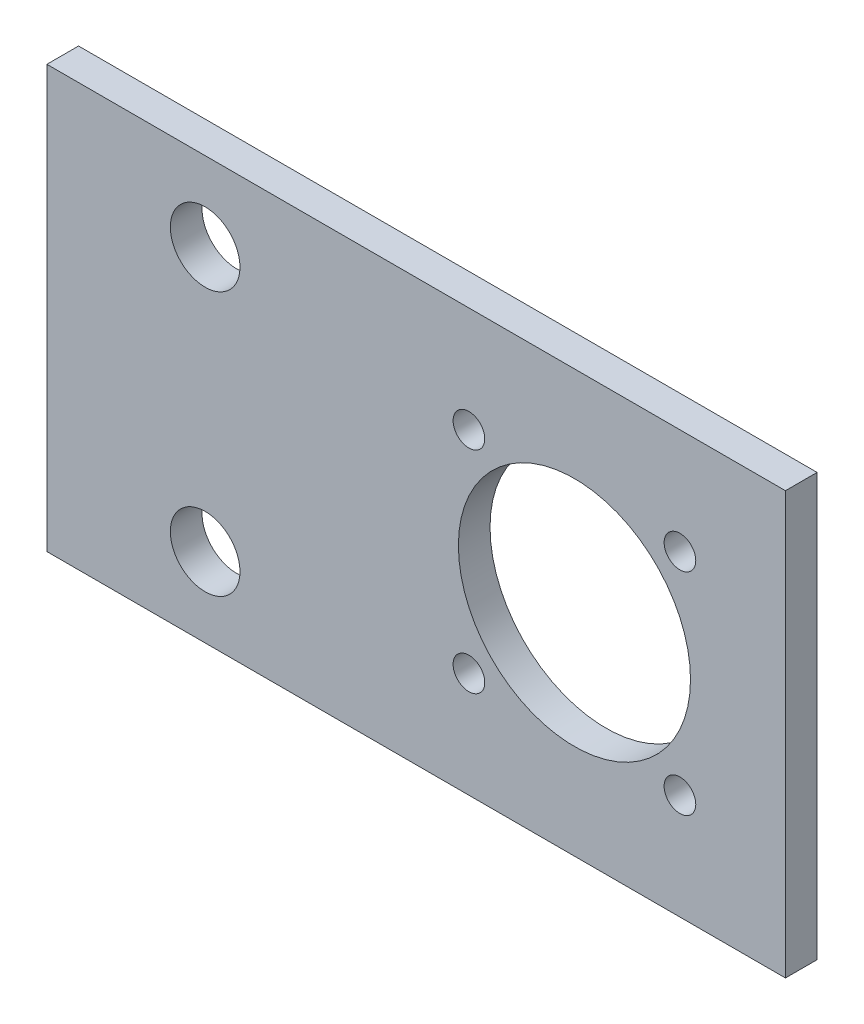
ISO-10303-21;
HEADER;
FILE_DESCRIPTION(('STEP AP214'),'2;1');
FILE_NAME('part.step','',(''),(''),'','','');
FILE_SCHEMA(('AUTOMOTIVE_DESIGN { 1 0 10303 214 1 1 1 1 }'));
ENDSEC;
DATA;
#1=APPLICATION_CONTEXT('core data for automotive mechanical design processes');
#2=APPLICATION_PROTOCOL_DEFINITION('international standard','automotive_design',2000,#1);
#3=PRODUCT_CONTEXT('',#1,'mechanical');
#4=PRODUCT('Part','Part','',(#3));
#5=PRODUCT_RELATED_PRODUCT_CATEGORY('part','',(#4));
#6=PRODUCT_DEFINITION_FORMATION('','',#4);
#7=PRODUCT_DEFINITION_CONTEXT('part definition',#1,'design');
#8=PRODUCT_DEFINITION('design','',#6,#7);
#9=PRODUCT_DEFINITION_SHAPE('','',#8);
#10=(LENGTH_UNIT() NAMED_UNIT(*) SI_UNIT(.MILLI.,.METRE.));
#11=(NAMED_UNIT(*) PLANE_ANGLE_UNIT() SI_UNIT($,.RADIAN.));
#12=(NAMED_UNIT(*) SI_UNIT($,.STERADIAN.) SOLID_ANGLE_UNIT());
#13=UNCERTAINTY_MEASURE_WITH_UNIT(LENGTH_MEASURE(1.E-05),#10,'distance_accuracy_value','');
#14=(GEOMETRIC_REPRESENTATION_CONTEXT(3) GLOBAL_UNCERTAINTY_ASSIGNED_CONTEXT((#13)) GLOBAL_UNIT_ASSIGNED_CONTEXT((#10,
#11,#12)) REPRESENTATION_CONTEXT('',''));
#15=CARTESIAN_POINT('',(0.,0.,0.));
#16=DIRECTION('',(0.,0.,1.));
#17=DIRECTION('',(1.,0.,0.));
#18=AXIS2_PLACEMENT_3D('',#15,#16,#17);
#19=CARTESIAN_POINT('',(-15.5499948658782,310.000000000003,3.));
#20=DIRECTION('',(-1.,0.,0.));
#21=DIRECTION('',(0.,0.,1.));
#22=AXIS2_PLACEMENT_3D('',#19,#20,#21);
#23=PLANE('',#22);
#24=DIRECTION('',(0.,1.,0.));
#25=VECTOR('',#24,1.);
#26=CARTESIAN_POINT('',(-15.5499948658782,310.000000000003,0.));
#27=LINE('',#26,#25);
#28=CARTESIAN_POINT('',(-15.5499948658782,310.000000000003,0.));
#29=VERTEX_POINT('',#28);
#30=CARTESIAN_POINT('',(-15.5499948658782,350.000000000003,0.));
#31=VERTEX_POINT('',#30);
#32=EDGE_CURVE('E111',#29,#31,#27,.T.);
#33=ORIENTED_EDGE('',*,*,#32,.F.);
#34=DIRECTION('',(0.,0.,-1.));
#35=VECTOR('',#34,1.);
#36=CARTESIAN_POINT('',(-15.5499948658782,310.000000000003,3.));
#37=LINE('',#36,#35);
#38=CARTESIAN_POINT('',(-15.5499948658782,310.000000000003,3.));
#39=VERTEX_POINT('',#38);
#40=EDGE_CURVE('E11',#39,#29,#37,.T.);
#41=ORIENTED_EDGE('',*,*,#40,.F.);
#42=DIRECTION('',(0.,1.,0.));
#43=VECTOR('',#42,1.);
#44=CARTESIAN_POINT('',(-15.5499948658782,310.000000000003,3.));
#45=LINE('',#44,#43);
#46=CARTESIAN_POINT('',(-15.5499948658782,350.000000000003,3.));
#47=VERTEX_POINT('',#46);
#48=EDGE_CURVE('E103',#39,#47,#45,.T.);
#49=ORIENTED_EDGE('',*,*,#48,.T.);
#50=DIRECTION('',(0.,0.,-1.));
#51=VECTOR('',#50,1.);
#52=CARTESIAN_POINT('',(-15.5499948658782,350.000000000003,3.));
#53=LINE('',#52,#51);
#54=EDGE_CURVE('E42',#47,#31,#53,.T.);
#55=ORIENTED_EDGE('',*,*,#54,.T.);
#56=EDGE_LOOP('',(#33,#41,#49,#55));
#57=FACE_BOUND('',#56,.T.);
#58=ADVANCED_FACE('F39',(#57),#23,.T.);
#59=CARTESIAN_POINT('',(-15.5499948658782,310.000000000003,3.));
#60=DIRECTION('',(0.,1.,0.));
#61=DIRECTION('',(0.,0.,1.));
#62=AXIS2_PLACEMENT_3D('',#59,#60,#61);
#63=PLANE('',#62);
#64=DIRECTION('',(1.,0.,0.));
#65=VECTOR('',#64,1.);
#66=CARTESIAN_POINT('',(-15.5499948658782,310.000000000003,0.));
#67=LINE('',#66,#65);
#68=CARTESIAN_POINT('',(54.4500051341218,310.000000000003,0.));
#69=VERTEX_POINT('',#68);
#70=EDGE_CURVE('E73',#29,#69,#67,.T.);
#71=ORIENTED_EDGE('',*,*,#70,.T.);
#72=DIRECTION('',(0.,0.,-1.));
#73=VECTOR('',#72,1.);
#74=CARTESIAN_POINT('',(54.4500051341218,310.000000000003,3.));
#75=LINE('',#74,#73);
#76=CARTESIAN_POINT('',(54.4500051341218,310.000000000003,3.));
#77=VERTEX_POINT('',#76);
#78=EDGE_CURVE('E49',#77,#69,#75,.T.);
#79=ORIENTED_EDGE('',*,*,#78,.F.);
#80=DIRECTION('',(1.,0.,0.));
#81=VECTOR('',#80,1.);
#82=CARTESIAN_POINT('',(-15.5499948658782,310.000000000003,3.));
#83=LINE('',#82,#81);
#84=EDGE_CURVE('E90',#39,#77,#83,.T.);
#85=ORIENTED_EDGE('',*,*,#84,.F.);
#86=ORIENTED_EDGE('',*,*,#40,.T.);
#87=EDGE_LOOP('',(#71,#79,#85,#86));
#88=FACE_BOUND('',#87,.T.);
#89=ADVANCED_FACE('F128',(#88),#63,.F.);
#90=CARTESIAN_POINT('',(54.4500051341218,310.000000000003,3.));
#91=DIRECTION('',(-1.,0.,0.));
#92=DIRECTION('',(0.,0.,1.));
#93=AXIS2_PLACEMENT_3D('',#90,#91,#92);
#94=PLANE('',#93);
#95=DIRECTION('',(0.,1.,0.));
#96=VECTOR('',#95,1.);
#97=CARTESIAN_POINT('',(54.4500051341218,310.000000000003,0.));
#98=LINE('',#97,#96);
#99=CARTESIAN_POINT('',(54.4500051341218,350.000000000003,0.));
#100=VERTEX_POINT('',#99);
#101=EDGE_CURVE('E98',#69,#100,#98,.T.);
#102=ORIENTED_EDGE('',*,*,#101,.T.);
#103=DIRECTION('',(0.,0.,-1.));
#104=VECTOR('',#103,1.);
#105=CARTESIAN_POINT('',(54.4500051341218,350.000000000003,3.));
#106=LINE('',#105,#104);
#107=CARTESIAN_POINT('',(54.4500051341218,350.000000000003,3.));
#108=VERTEX_POINT('',#107);
#109=EDGE_CURVE('E95',#108,#100,#106,.T.);
#110=ORIENTED_EDGE('',*,*,#109,.F.);
#111=DIRECTION('',(0.,1.,0.));
#112=VECTOR('',#111,1.);
#113=CARTESIAN_POINT('',(54.4500051341218,310.000000000003,3.));
#114=LINE('',#113,#112);
#115=EDGE_CURVE('E85',#77,#108,#114,.T.);
#116=ORIENTED_EDGE('',*,*,#115,.F.);
#117=ORIENTED_EDGE('',*,*,#78,.T.);
#118=EDGE_LOOP('',(#102,#110,#116,#117));
#119=FACE_BOUND('',#118,.T.);
#120=ADVANCED_FACE('F96',(#119),#94,.F.);
#121=CARTESIAN_POINT('',(-15.5499948658782,350.000000000003,3.));
#122=DIRECTION('',(0.,1.,0.));
#123=DIRECTION('',(0.,0.,1.));
#124=AXIS2_PLACEMENT_3D('',#121,#122,#123);
#125=PLANE('',#124);
#126=DIRECTION('',(1.,0.,0.));
#127=VECTOR('',#126,1.);
#128=CARTESIAN_POINT('',(-15.5499948658782,350.000000000003,0.));
#129=LINE('',#128,#127);
#130=EDGE_CURVE('E115',#31,#100,#129,.T.);
#131=ORIENTED_EDGE('',*,*,#130,.F.);
#132=ORIENTED_EDGE('',*,*,#54,.F.);
#133=DIRECTION('',(1.,0.,0.));
#134=VECTOR('',#133,1.);
#135=CARTESIAN_POINT('',(-15.5499948658782,350.000000000003,3.));
#136=LINE('',#135,#134);
#137=EDGE_CURVE('E89',#47,#108,#136,.T.);
#138=ORIENTED_EDGE('',*,*,#137,.T.);
#139=ORIENTED_EDGE('',*,*,#109,.T.);
#140=EDGE_LOOP('',(#131,#132,#138,#139));
#141=FACE_BOUND('',#140,.T.);
#142=ADVANCED_FACE('F101',(#141),#125,.T.);
#143=CARTESIAN_POINT('',(0.,0.,3.));
#144=DIRECTION('',(0.,0.,-1.));
#145=DIRECTION('',(-1.,0.,0.));
#146=AXIS2_PLACEMENT_3D('',#143,#144,#145);
#147=PLANE('',#146);
#148=CARTESIAN_POINT('',(34.4500051341218,330.000000000003,3.));
#149=DIRECTION('',(0.,0.,-1.));
#150=DIRECTION('',(-1.,0.,0.));
#151=AXIS2_PLACEMENT_3D('',#148,#149,#150);
#152=CIRCLE('',#151,11.);
#153=CARTESIAN_POINT('',(23.4500051341218,330.000000000003,3.));
#154=VERTEX_POINT('',#153);
#155=EDGE_CURVE('E182',#154,#154,#152,.T.);
#156=ORIENTED_EDGE('',*,*,#155,.T.);
#157=EDGE_LOOP('',(#156));
#158=FACE_BOUND('',#157,.T.);
#159=CARTESIAN_POINT('',(-0.549994865878187,342.500000000003,3.));
#160=DIRECTION('',(0.,0.,1.));
#161=DIRECTION('',(1.,0.,0.));
#162=AXIS2_PLACEMENT_3D('',#159,#160,#161);
#163=CIRCLE('',#162,3.3);
#164=CARTESIAN_POINT('',(2.75000513412181,342.500000000003,3.));
#165=VERTEX_POINT('',#164);
#166=EDGE_CURVE('E189',#165,#165,#163,.T.);
#167=ORIENTED_EDGE('',*,*,#166,.F.);
#168=EDGE_LOOP('',(#167));
#169=FACE_BOUND('',#168,.T.);
#170=CARTESIAN_POINT('',(-0.549994865878187,317.500000000003,3.));
#171=DIRECTION('',(0.,0.,1.));
#172=DIRECTION('',(1.,0.,0.));
#173=AXIS2_PLACEMENT_3D('',#170,#171,#172);
#174=CIRCLE('',#173,3.3);
#175=CARTESIAN_POINT('',(2.75000513412181,317.500000000003,3.));
#176=VERTEX_POINT('',#175);
#177=EDGE_CURVE('E199',#176,#176,#174,.T.);
#178=ORIENTED_EDGE('',*,*,#177,.F.);
#179=EDGE_LOOP('',(#178));
#180=FACE_BOUND('',#179,.T.);
#181=CARTESIAN_POINT('',(24.4500051341218,340.000000000003,3.));
#182=DIRECTION('',(0.,0.,1.));
#183=DIRECTION('',(1.,0.,0.));
#184=AXIS2_PLACEMENT_3D('',#181,#182,#183);
#185=CIRCLE('',#184,1.5);
#186=CARTESIAN_POINT('',(25.9500051341218,340.000000000003,3.));
#187=VERTEX_POINT('',#186);
#188=EDGE_CURVE('E207',#187,#187,#185,.T.);
#189=ORIENTED_EDGE('',*,*,#188,.F.);
#190=EDGE_LOOP('',(#189));
#191=FACE_BOUND('',#190,.T.);
#192=CARTESIAN_POINT('',(44.4500051341218,340.000000000003,3.));
#193=DIRECTION('',(0.,0.,1.));
#194=DIRECTION('',(1.,0.,0.));
#195=AXIS2_PLACEMENT_3D('',#192,#193,#194);
#196=CIRCLE('',#195,1.5);
#197=CARTESIAN_POINT('',(45.9500051341218,340.000000000003,3.));
#198=VERTEX_POINT('',#197);
#199=EDGE_CURVE('E215',#198,#198,#196,.T.);
#200=ORIENTED_EDGE('',*,*,#199,.F.);
#201=EDGE_LOOP('',(#200));
#202=FACE_BOUND('',#201,.T.);
#203=CARTESIAN_POINT('',(44.4500051341218,320.000000000003,3.));
#204=DIRECTION('',(0.,0.,1.));
#205=DIRECTION('',(1.,0.,0.));
#206=AXIS2_PLACEMENT_3D('',#203,#204,#205);
#207=CIRCLE('',#206,1.5);
#208=CARTESIAN_POINT('',(45.9500051341218,320.000000000003,3.));
#209=VERTEX_POINT('',#208);
#210=EDGE_CURVE('E223',#209,#209,#207,.T.);
#211=ORIENTED_EDGE('',*,*,#210,.F.);
#212=EDGE_LOOP('',(#211));
#213=FACE_BOUND('',#212,.T.);
#214=CARTESIAN_POINT('',(24.4500051341218,320.000000000003,3.));
#215=DIRECTION('',(0.,0.,1.));
#216=DIRECTION('',(1.,0.,0.));
#217=AXIS2_PLACEMENT_3D('',#214,#215,#216);
#218=CIRCLE('',#217,1.5);
#219=CARTESIAN_POINT('',(25.9500051341218,320.000000000003,3.));
#220=VERTEX_POINT('',#219);
#221=EDGE_CURVE('E231',#220,#220,#218,.T.);
#222=ORIENTED_EDGE('',*,*,#221,.F.);
#223=EDGE_LOOP('',(#222));
#224=FACE_BOUND('',#223,.T.);
#225=ORIENTED_EDGE('',*,*,#48,.F.);
#226=ORIENTED_EDGE('',*,*,#84,.T.);
#227=ORIENTED_EDGE('',*,*,#115,.T.);
#228=ORIENTED_EDGE('',*,*,#137,.F.);
#229=EDGE_LOOP('',(#225,#226,#227,#228));
#230=FACE_BOUND('',#229,.T.);
#231=ADVANCED_FACE('F88',(#158,#169,#180,#191,#202,#213,#224,#230),#147,.F.);
#232=CARTESIAN_POINT('',(0.,0.,0.));
#233=DIRECTION('',(0.,0.,-1.));
#234=DIRECTION('',(-1.,0.,0.));
#235=AXIS2_PLACEMENT_3D('',#232,#233,#234);
#236=PLANE('',#235);
#237=CARTESIAN_POINT('',(34.4500051341218,330.000000000003,0.));
#238=DIRECTION('',(0.,0.,-1.));
#239=DIRECTION('',(-1.,0.,0.));
#240=AXIS2_PLACEMENT_3D('',#237,#238,#239);
#241=CIRCLE('',#240,11.);
#242=CARTESIAN_POINT('',(23.4500051341218,330.000000000003,0.));
#243=VERTEX_POINT('',#242);
#244=EDGE_CURVE('E185',#243,#243,#241,.T.);
#245=ORIENTED_EDGE('',*,*,#244,.F.);
#246=EDGE_LOOP('',(#245));
#247=FACE_BOUND('',#246,.T.);
#248=CARTESIAN_POINT('',(-0.549994865878187,342.500000000003,0.));
#249=DIRECTION('',(0.,0.,1.));
#250=DIRECTION('',(1.,0.,0.));
#251=AXIS2_PLACEMENT_3D('',#248,#249,#250);
#252=CIRCLE('',#251,3.3);
#253=CARTESIAN_POINT('',(2.75000513412181,342.500000000003,0.));
#254=VERTEX_POINT('',#253);
#255=EDGE_CURVE('E195',#254,#254,#252,.T.);
#256=ORIENTED_EDGE('',*,*,#255,.T.);
#257=EDGE_LOOP('',(#256));
#258=FACE_BOUND('',#257,.T.);
#259=CARTESIAN_POINT('',(-0.549994865878187,317.500000000003,0.));
#260=DIRECTION('',(0.,0.,1.));
#261=DIRECTION('',(1.,0.,0.));
#262=AXIS2_PLACEMENT_3D('',#259,#260,#261);
#263=CIRCLE('',#262,3.3);
#264=CARTESIAN_POINT('',(2.75000513412181,317.500000000003,0.));
#265=VERTEX_POINT('',#264);
#266=EDGE_CURVE('E203',#265,#265,#263,.T.);
#267=ORIENTED_EDGE('',*,*,#266,.T.);
#268=EDGE_LOOP('',(#267));
#269=FACE_BOUND('',#268,.T.);
#270=CARTESIAN_POINT('',(24.4500051341218,340.000000000003,0.));
#271=DIRECTION('',(0.,0.,1.));
#272=DIRECTION('',(1.,0.,0.));
#273=AXIS2_PLACEMENT_3D('',#270,#271,#272);
#274=CIRCLE('',#273,1.5);
#275=CARTESIAN_POINT('',(25.9500051341218,340.000000000003,0.));
#276=VERTEX_POINT('',#275);
#277=EDGE_CURVE('E211',#276,#276,#274,.T.);
#278=ORIENTED_EDGE('',*,*,#277,.T.);
#279=EDGE_LOOP('',(#278));
#280=FACE_BOUND('',#279,.T.);
#281=CARTESIAN_POINT('',(44.4500051341218,340.000000000003,0.));
#282=DIRECTION('',(0.,0.,1.));
#283=DIRECTION('',(1.,0.,0.));
#284=AXIS2_PLACEMENT_3D('',#281,#282,#283);
#285=CIRCLE('',#284,1.5);
#286=CARTESIAN_POINT('',(45.9500051341218,340.000000000003,0.));
#287=VERTEX_POINT('',#286);
#288=EDGE_CURVE('E219',#287,#287,#285,.T.);
#289=ORIENTED_EDGE('',*,*,#288,.T.);
#290=EDGE_LOOP('',(#289));
#291=FACE_BOUND('',#290,.T.);
#292=CARTESIAN_POINT('',(44.4500051341218,320.000000000003,0.));
#293=DIRECTION('',(0.,0.,1.));
#294=DIRECTION('',(1.,0.,0.));
#295=AXIS2_PLACEMENT_3D('',#292,#293,#294);
#296=CIRCLE('',#295,1.5);
#297=CARTESIAN_POINT('',(45.9500051341218,320.000000000003,0.));
#298=VERTEX_POINT('',#297);
#299=EDGE_CURVE('E227',#298,#298,#296,.T.);
#300=ORIENTED_EDGE('',*,*,#299,.T.);
#301=EDGE_LOOP('',(#300));
#302=FACE_BOUND('',#301,.T.);
#303=CARTESIAN_POINT('',(24.4500051341218,320.000000000003,0.));
#304=DIRECTION('',(0.,0.,1.));
#305=DIRECTION('',(1.,0.,0.));
#306=AXIS2_PLACEMENT_3D('',#303,#304,#305);
#307=CIRCLE('',#306,1.5);
#308=CARTESIAN_POINT('',(25.9500051341218,320.000000000003,0.));
#309=VERTEX_POINT('',#308);
#310=EDGE_CURVE('E116',#309,#309,#307,.T.);
#311=ORIENTED_EDGE('',*,*,#310,.T.);
#312=EDGE_LOOP('',(#311));
#313=FACE_BOUND('',#312,.T.);
#314=ORIENTED_EDGE('',*,*,#32,.T.);
#315=ORIENTED_EDGE('',*,*,#130,.T.);
#316=ORIENTED_EDGE('',*,*,#101,.F.);
#317=ORIENTED_EDGE('',*,*,#70,.F.);
#318=EDGE_LOOP('',(#314,#315,#316,#317));
#319=FACE_BOUND('',#318,.T.);
#320=ADVANCED_FACE('F125',(#247,#258,#269,#280,#291,#302,#313,#319),#236,.T.);
#321=CARTESIAN_POINT('',(24.4500051341218,320.000000000003,3.));
#322=DIRECTION('',(0.,0.,1.));
#323=DIRECTION('',(1.,0.,0.));
#324=AXIS2_PLACEMENT_3D('',#321,#322,#323);
#325=CYLINDRICAL_SURFACE('',#324,1.5);
#326=ORIENTED_EDGE('',*,*,#310,.F.);
#327=EDGE_LOOP('',(#326));
#328=FACE_BOUND('',#327,.T.);
#329=ORIENTED_EDGE('',*,*,#221,.T.);
#330=EDGE_LOOP('',(#329));
#331=FACE_BOUND('',#330,.T.);
#332=ADVANCED_FACE('F147',(#328,#331),#325,.F.);
#333=CARTESIAN_POINT('',(44.4500051341218,320.000000000003,3.));
#334=DIRECTION('',(0.,0.,1.));
#335=DIRECTION('',(1.,0.,0.));
#336=AXIS2_PLACEMENT_3D('',#333,#334,#335);
#337=CYLINDRICAL_SURFACE('',#336,1.5);
#338=ORIENTED_EDGE('',*,*,#299,.F.);
#339=EDGE_LOOP('',(#338));
#340=FACE_BOUND('',#339,.T.);
#341=ORIENTED_EDGE('',*,*,#210,.T.);
#342=EDGE_LOOP('',(#341));
#343=FACE_BOUND('',#342,.T.);
#344=ADVANCED_FACE('F154',(#340,#343),#337,.F.);
#345=CARTESIAN_POINT('',(44.4500051341218,340.000000000003,3.));
#346=DIRECTION('',(0.,0.,1.));
#347=DIRECTION('',(1.,0.,0.));
#348=AXIS2_PLACEMENT_3D('',#345,#346,#347);
#349=CYLINDRICAL_SURFACE('',#348,1.5);
#350=ORIENTED_EDGE('',*,*,#288,.F.);
#351=EDGE_LOOP('',(#350));
#352=FACE_BOUND('',#351,.T.);
#353=ORIENTED_EDGE('',*,*,#199,.T.);
#354=EDGE_LOOP('',(#353));
#355=FACE_BOUND('',#354,.T.);
#356=ADVANCED_FACE('F158',(#352,#355),#349,.F.);
#357=CARTESIAN_POINT('',(24.4500051341218,340.000000000003,3.));
#358=DIRECTION('',(0.,0.,1.));
#359=DIRECTION('',(1.,0.,0.));
#360=AXIS2_PLACEMENT_3D('',#357,#358,#359);
#361=CYLINDRICAL_SURFACE('',#360,1.5);
#362=ORIENTED_EDGE('',*,*,#277,.F.);
#363=EDGE_LOOP('',(#362));
#364=FACE_BOUND('',#363,.T.);
#365=ORIENTED_EDGE('',*,*,#188,.T.);
#366=EDGE_LOOP('',(#365));
#367=FACE_BOUND('',#366,.T.);
#368=ADVANCED_FACE('F162',(#364,#367),#361,.F.);
#369=CARTESIAN_POINT('',(-0.549994865878187,317.500000000003,3.));
#370=DIRECTION('',(0.,0.,1.));
#371=DIRECTION('',(1.,0.,0.));
#372=AXIS2_PLACEMENT_3D('',#369,#370,#371);
#373=CYLINDRICAL_SURFACE('',#372,3.3);
#374=ORIENTED_EDGE('',*,*,#266,.F.);
#375=EDGE_LOOP('',(#374));
#376=FACE_BOUND('',#375,.T.);
#377=ORIENTED_EDGE('',*,*,#177,.T.);
#378=EDGE_LOOP('',(#377));
#379=FACE_BOUND('',#378,.T.);
#380=ADVANCED_FACE('F166',(#376,#379),#373,.F.);
#381=CARTESIAN_POINT('',(-0.549994865878187,342.500000000003,3.));
#382=DIRECTION('',(0.,0.,1.));
#383=DIRECTION('',(1.,0.,0.));
#384=AXIS2_PLACEMENT_3D('',#381,#382,#383);
#385=CYLINDRICAL_SURFACE('',#384,3.3);
#386=ORIENTED_EDGE('',*,*,#255,.F.);
#387=EDGE_LOOP('',(#386));
#388=FACE_BOUND('',#387,.T.);
#389=ORIENTED_EDGE('',*,*,#166,.T.);
#390=EDGE_LOOP('',(#389));
#391=FACE_BOUND('',#390,.T.);
#392=ADVANCED_FACE('F170',(#388,#391),#385,.F.);
#393=CARTESIAN_POINT('',(34.4500051341218,330.000000000003,0.));
#394=DIRECTION('',(0.,0.,-1.));
#395=DIRECTION('',(-1.,0.,0.));
#396=AXIS2_PLACEMENT_3D('',#393,#394,#395);
#397=CYLINDRICAL_SURFACE('',#396,11.);
#398=ORIENTED_EDGE('',*,*,#155,.F.);
#399=EDGE_LOOP('',(#398));
#400=FACE_BOUND('',#399,.T.);
#401=ORIENTED_EDGE('',*,*,#244,.T.);
#402=EDGE_LOOP('',(#401));
#403=FACE_BOUND('',#402,.T.);
#404=ADVANCED_FACE('F174',(#400,#403),#397,.F.);
#405=CLOSED_SHELL('',(#58,#89,#120,#142,#231,#320,#332,#344,#356,#368,#380,#392,#404));
#406=MANIFOLD_SOLID_BREP('B2',#405);
#407=ADVANCED_BREP_SHAPE_REPRESENTATION('',(#18,#406),#14);
#408=SHAPE_DEFINITION_REPRESENTATION(#9,#407);
ENDSEC;
END-ISO-10303-21;
